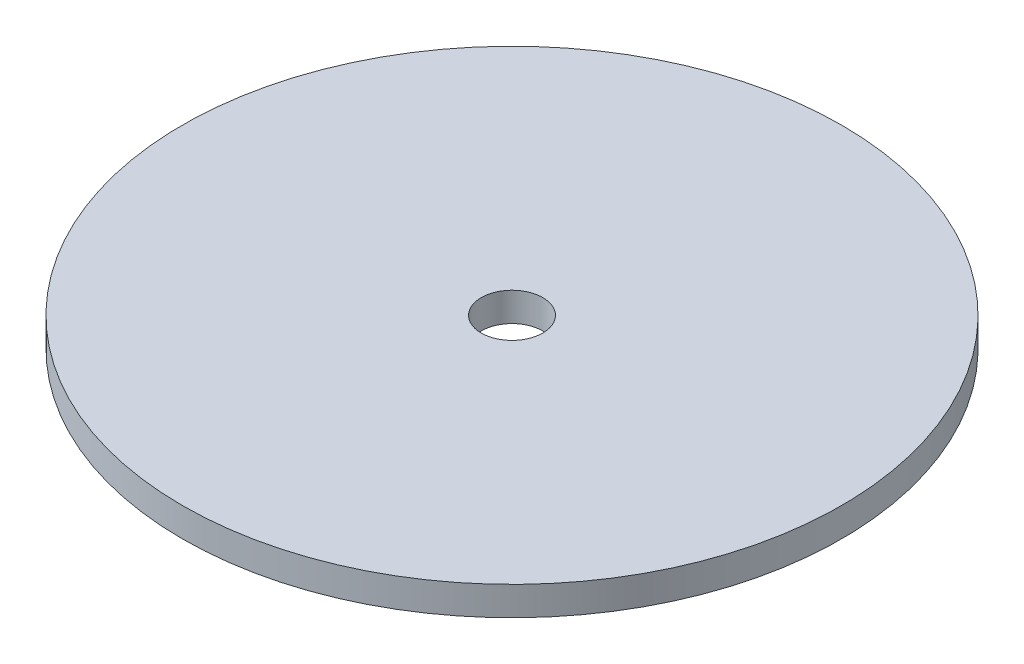
ISO-10303-21;
HEADER;
FILE_DESCRIPTION(('STEP AP214'),'2;1');
FILE_NAME('part.step','',(''),(''),'','','');
FILE_SCHEMA(('AUTOMOTIVE_DESIGN { 1 0 10303 214 1 1 1 1 }'));
ENDSEC;
DATA;
#1=APPLICATION_CONTEXT('core data for automotive mechanical design processes');
#2=APPLICATION_PROTOCOL_DEFINITION('international standard','automotive_design',2000,#1);
#3=PRODUCT_CONTEXT('',#1,'mechanical');
#4=PRODUCT('Part','Part','',(#3));
#5=PRODUCT_RELATED_PRODUCT_CATEGORY('part','',(#4));
#6=PRODUCT_DEFINITION_FORMATION('','',#4);
#7=PRODUCT_DEFINITION_CONTEXT('part definition',#1,'design');
#8=PRODUCT_DEFINITION('design','',#6,#7);
#9=PRODUCT_DEFINITION_SHAPE('','',#8);
#10=(LENGTH_UNIT() NAMED_UNIT(*) SI_UNIT(.MILLI.,.METRE.));
#11=(NAMED_UNIT(*) PLANE_ANGLE_UNIT() SI_UNIT($,.RADIAN.));
#12=(NAMED_UNIT(*) SI_UNIT($,.STERADIAN.) SOLID_ANGLE_UNIT());
#13=UNCERTAINTY_MEASURE_WITH_UNIT(LENGTH_MEASURE(1.E-05),#10,'distance_accuracy_value','');
#14=(GEOMETRIC_REPRESENTATION_CONTEXT(3) GLOBAL_UNCERTAINTY_ASSIGNED_CONTEXT((#13)) GLOBAL_UNIT_ASSIGNED_CONTEXT((#10,
#11,#12)) REPRESENTATION_CONTEXT('',''));
#15=CARTESIAN_POINT('',(0.,0.,0.));
#16=DIRECTION('',(0.,0.,1.));
#17=DIRECTION('',(1.,0.,0.));
#18=AXIS2_PLACEMENT_3D('',#15,#16,#17);
#19=CARTESIAN_POINT('',(0.,1.5875,0.));
#20=DIRECTION('',(0.,-1.,0.));
#21=DIRECTION('',(0.,0.,-1.));
#22=AXIS2_PLACEMENT_3D('',#19,#20,#21);
#23=CYLINDRICAL_SURFACE('',#22,36.195);
#24=CARTESIAN_POINT('',(0.,1.5875,0.));
#25=DIRECTION('',(0.,1.,0.));
#26=DIRECTION('',(0.,0.,1.));
#27=AXIS2_PLACEMENT_3D('',#24,#25,#26);
#28=CIRCLE('',#27,36.195);
#29=CARTESIAN_POINT('',(0.,1.5875,36.195));
#30=VERTEX_POINT('',#29);
#31=EDGE_CURVE('E10',#30,#30,#28,.T.);
#32=ORIENTED_EDGE('',*,*,#31,.F.);
#33=EDGE_LOOP('',(#32));
#34=FACE_BOUND('',#33,.T.);
#35=CARTESIAN_POINT('',(0.,-1.5875,0.));
#36=DIRECTION('',(0.,1.,0.));
#37=DIRECTION('',(0.,0.,1.));
#38=AXIS2_PLACEMENT_3D('',#35,#36,#37);
#39=CIRCLE('',#38,36.195);
#40=CARTESIAN_POINT('',(0.,-1.5875,36.195));
#41=VERTEX_POINT('',#40);
#42=EDGE_CURVE('E42',#41,#41,#39,.T.);
#43=ORIENTED_EDGE('',*,*,#42,.T.);
#44=EDGE_LOOP('',(#43));
#45=FACE_BOUND('',#44,.T.);
#46=ADVANCED_FACE('F39',(#34,#45),#23,.T.);
#47=CARTESIAN_POINT('',(0.,1.5875,0.));
#48=DIRECTION('',(0.,1.,0.));
#49=DIRECTION('',(0.,0.,1.));
#50=AXIS2_PLACEMENT_3D('',#47,#48,#49);
#51=PLANE('',#50);
#52=CARTESIAN_POINT('',(0.,1.5875,0.));
#53=DIRECTION('',(0.,1.,0.));
#54=DIRECTION('',(0.,0.,1.));
#55=AXIS2_PLACEMENT_3D('',#52,#53,#54);
#56=CIRCLE('',#55,3.3782);
#57=CARTESIAN_POINT('',(0.,1.5875,3.3782));
#58=VERTEX_POINT('',#57);
#59=EDGE_CURVE('E56',#58,#58,#56,.T.);
#60=ORIENTED_EDGE('',*,*,#59,.F.);
#61=EDGE_LOOP('',(#60));
#62=FACE_BOUND('',#61,.T.);
#63=ORIENTED_EDGE('',*,*,#31,.T.);
#64=EDGE_LOOP('',(#63));
#65=FACE_BOUND('',#64,.T.);
#66=ADVANCED_FACE('F63',(#62,#65),#51,.T.);
#67=CARTESIAN_POINT('',(0.,-1.5875,0.));
#68=DIRECTION('',(0.,1.,0.));
#69=DIRECTION('',(0.,0.,1.));
#70=AXIS2_PLACEMENT_3D('',#67,#68,#69);
#71=PLANE('',#70);
#72=CARTESIAN_POINT('',(0.,-1.5875,0.));
#73=DIRECTION('',(0.,1.,0.));
#74=DIRECTION('',(0.,0.,1.));
#75=AXIS2_PLACEMENT_3D('',#72,#73,#74);
#76=CIRCLE('',#75,3.3782);
#77=CARTESIAN_POINT('',(0.,-1.5875,3.3782));
#78=VERTEX_POINT('',#77);
#79=EDGE_CURVE('E51',#78,#78,#76,.T.);
#80=ORIENTED_EDGE('',*,*,#79,.T.);
#81=EDGE_LOOP('',(#80));
#82=FACE_BOUND('',#81,.T.);
#83=ORIENTED_EDGE('',*,*,#42,.F.);
#84=EDGE_LOOP('',(#83));
#85=FACE_BOUND('',#84,.T.);
#86=ADVANCED_FACE('F65',(#82,#85),#71,.F.);
#87=CARTESIAN_POINT('',(0.,1.5875,0.));
#88=DIRECTION('',(0.,1.,0.));
#89=DIRECTION('',(0.,0.,1.));
#90=AXIS2_PLACEMENT_3D('',#87,#88,#89);
#91=CYLINDRICAL_SURFACE('',#90,3.3782);
#92=ORIENTED_EDGE('',*,*,#79,.F.);
#93=EDGE_LOOP('',(#92));
#94=FACE_BOUND('',#93,.T.);
#95=ORIENTED_EDGE('',*,*,#59,.T.);
#96=EDGE_LOOP('',(#95));
#97=FACE_BOUND('',#96,.T.);
#98=ADVANCED_FACE('F61',(#94,#97),#91,.F.);
#99=CLOSED_SHELL('',(#46,#66,#86,#98));
#100=MANIFOLD_SOLID_BREP('B2',#99);
#101=ADVANCED_BREP_SHAPE_REPRESENTATION('',(#18,#100),#14);
#102=SHAPE_DEFINITION_REPRESENTATION(#9,#101);
ENDSEC;
END-ISO-10303-21;
